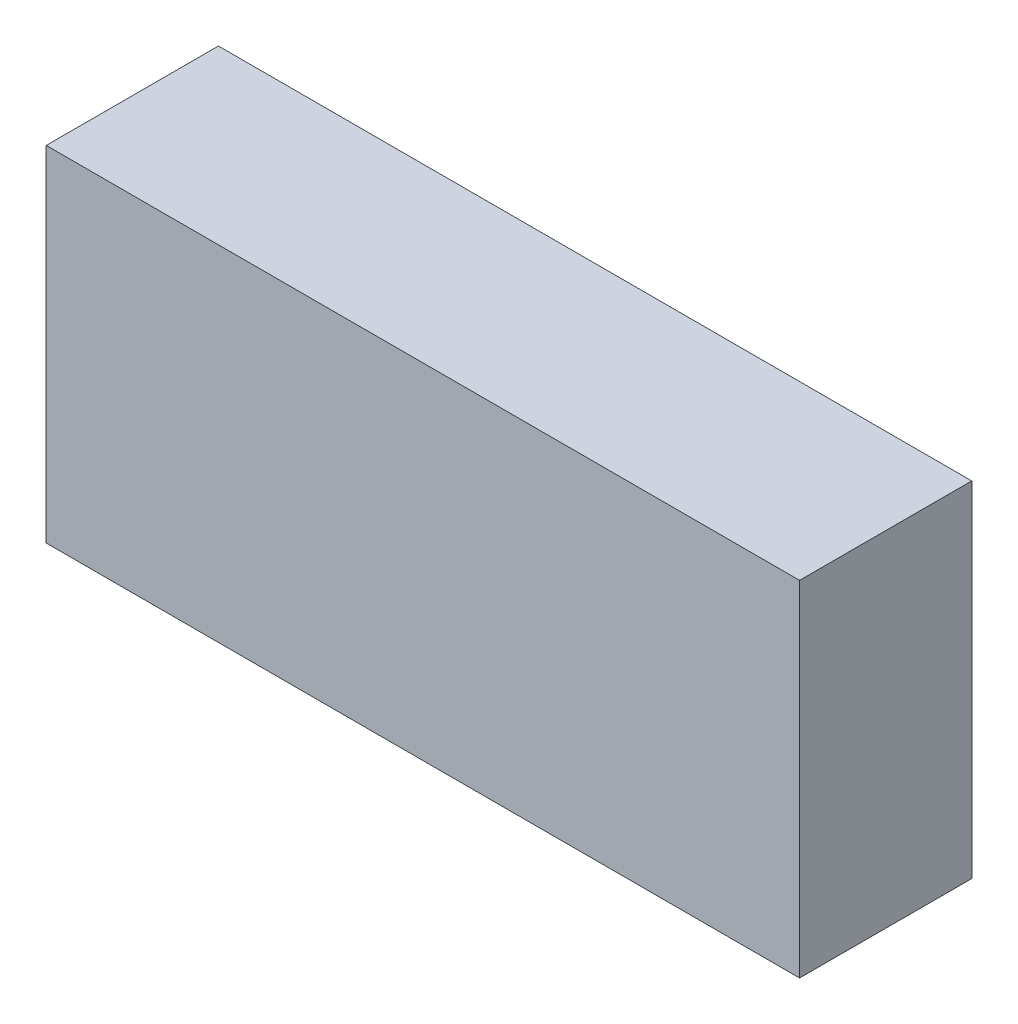
ISO-10303-21;
HEADER;
FILE_DESCRIPTION(('STEP AP214'),'2;1');
FILE_NAME('part.step','',(''),(''),'','','');
FILE_SCHEMA(('AUTOMOTIVE_DESIGN { 1 0 10303 214 1 1 1 1 }'));
ENDSEC;
DATA;
#1=APPLICATION_CONTEXT('core data for automotive mechanical design processes');
#2=APPLICATION_PROTOCOL_DEFINITION('international standard','automotive_design',2000,#1);
#3=PRODUCT_CONTEXT('',#1,'mechanical');
#4=PRODUCT('Part','Part','',(#3));
#5=PRODUCT_RELATED_PRODUCT_CATEGORY('part','',(#4));
#6=PRODUCT_DEFINITION_FORMATION('','',#4);
#7=PRODUCT_DEFINITION_CONTEXT('part definition',#1,'design');
#8=PRODUCT_DEFINITION('design','',#6,#7);
#9=PRODUCT_DEFINITION_SHAPE('','',#8);
#10=(LENGTH_UNIT() NAMED_UNIT(*) SI_UNIT(.MILLI.,.METRE.));
#11=(NAMED_UNIT(*) PLANE_ANGLE_UNIT() SI_UNIT($,.RADIAN.));
#12=(NAMED_UNIT(*) SI_UNIT($,.STERADIAN.) SOLID_ANGLE_UNIT());
#13=UNCERTAINTY_MEASURE_WITH_UNIT(LENGTH_MEASURE(1.E-05),#10,'distance_accuracy_value','');
#14=(GEOMETRIC_REPRESENTATION_CONTEXT(3) GLOBAL_UNCERTAINTY_ASSIGNED_CONTEXT((#13)) GLOBAL_UNIT_ASSIGNED_CONTEXT((#10,
#11,#12)) REPRESENTATION_CONTEXT('',''));
#15=CARTESIAN_POINT('',(0.,0.,0.));
#16=DIRECTION('',(0.,0.,1.));
#17=DIRECTION('',(1.,0.,0.));
#18=AXIS2_PLACEMENT_3D('',#15,#16,#17);
#19=CARTESIAN_POINT('',(-17.5,16.,4.));
#20=DIRECTION('',(1.,0.,0.));
#21=DIRECTION('',(0.,0.,-1.));
#22=AXIS2_PLACEMENT_3D('',#19,#20,#21);
#23=PLANE('',#22);
#24=DIRECTION('',(0.,0.,1.));
#25=VECTOR('',#24,1.);
#26=CARTESIAN_POINT('',(-17.5,0.,4.));
#27=LINE('',#26,#25);
#28=CARTESIAN_POINT('',(-17.5,0.,-4.));
#29=VERTEX_POINT('',#28);
#30=CARTESIAN_POINT('',(-17.5,0.,4.));
#31=VERTEX_POINT('',#30);
#32=EDGE_CURVE('E111',#29,#31,#27,.T.);
#33=ORIENTED_EDGE('',*,*,#32,.T.);
#34=DIRECTION('',(0.,-1.,0.));
#35=VECTOR('',#34,1.);
#36=CARTESIAN_POINT('',(-17.5,16.,4.));
#37=LINE('',#36,#35);
#38=CARTESIAN_POINT('',(-17.5,16.,4.));
#39=VERTEX_POINT('',#38);
#40=EDGE_CURVE('E11',#39,#31,#37,.T.);
#41=ORIENTED_EDGE('',*,*,#40,.F.);
#42=DIRECTION('',(0.,0.,1.));
#43=VECTOR('',#42,1.);
#44=CARTESIAN_POINT('',(-17.5,16.,4.));
#45=LINE('',#44,#43);
#46=CARTESIAN_POINT('',(-17.5,16.,-4.));
#47=VERTEX_POINT('',#46);
#48=EDGE_CURVE('E100',#47,#39,#45,.T.);
#49=ORIENTED_EDGE('',*,*,#48,.F.);
#50=DIRECTION('',(0.,-1.,0.));
#51=VECTOR('',#50,1.);
#52=CARTESIAN_POINT('',(-17.5,16.,-4.));
#53=LINE('',#52,#51);
#54=EDGE_CURVE('E108',#47,#29,#53,.T.);
#55=ORIENTED_EDGE('',*,*,#54,.T.);
#56=EDGE_LOOP('',(#33,#41,#49,#55));
#57=FACE_BOUND('',#56,.T.);
#58=ADVANCED_FACE('F44',(#57),#23,.F.);
#59=CARTESIAN_POINT('',(17.5,16.,4.));
#60=DIRECTION('',(0.,0.,-1.));
#61=DIRECTION('',(-1.,0.,0.));
#62=AXIS2_PLACEMENT_3D('',#59,#60,#61);
#63=PLANE('',#62);
#64=DIRECTION('',(1.,0.,0.));
#65=VECTOR('',#64,1.);
#66=CARTESIAN_POINT('',(17.5,0.,4.));
#67=LINE('',#66,#65);
#68=CARTESIAN_POINT('',(17.5,0.,4.));
#69=VERTEX_POINT('',#68);
#70=EDGE_CURVE('E105',#31,#69,#67,.T.);
#71=ORIENTED_EDGE('',*,*,#70,.T.);
#72=DIRECTION('',(0.,-1.,0.));
#73=VECTOR('',#72,1.);
#74=CARTESIAN_POINT('',(17.5,16.,4.));
#75=LINE('',#74,#73);
#76=CARTESIAN_POINT('',(17.5,16.,4.));
#77=VERTEX_POINT('',#76);
#78=EDGE_CURVE('E53',#77,#69,#75,.T.);
#79=ORIENTED_EDGE('',*,*,#78,.F.);
#80=DIRECTION('',(1.,0.,0.));
#81=VECTOR('',#80,1.);
#82=CARTESIAN_POINT('',(17.5,16.,4.));
#83=LINE('',#82,#81);
#84=EDGE_CURVE('E95',#39,#77,#83,.T.);
#85=ORIENTED_EDGE('',*,*,#84,.F.);
#86=ORIENTED_EDGE('',*,*,#40,.T.);
#87=EDGE_LOOP('',(#71,#79,#85,#86));
#88=FACE_BOUND('',#87,.T.);
#89=ADVANCED_FACE('F102',(#88),#63,.F.);
#90=CARTESIAN_POINT('',(17.5,16.,4.));
#91=DIRECTION('',(-1.,0.,0.));
#92=DIRECTION('',(0.,0.,1.));
#93=AXIS2_PLACEMENT_3D('',#90,#91,#92);
#94=PLANE('',#93);
#95=DIRECTION('',(0.,0.,-1.));
#96=VECTOR('',#95,1.);
#97=CARTESIAN_POINT('',(17.5,0.,4.));
#98=LINE('',#97,#96);
#99=CARTESIAN_POINT('',(17.5,0.,-4.));
#100=VERTEX_POINT('',#99);
#101=EDGE_CURVE('E80',#69,#100,#98,.T.);
#102=ORIENTED_EDGE('',*,*,#101,.T.);
#103=DIRECTION('',(0.,-1.,0.));
#104=VECTOR('',#103,1.);
#105=CARTESIAN_POINT('',(17.5,16.,-4.));
#106=LINE('',#105,#104);
#107=CARTESIAN_POINT('',(17.5,16.,-4.));
#108=VERTEX_POINT('',#107);
#109=EDGE_CURVE('E101',#108,#100,#106,.T.);
#110=ORIENTED_EDGE('',*,*,#109,.F.);
#111=DIRECTION('',(0.,0.,-1.));
#112=VECTOR('',#111,1.);
#113=CARTESIAN_POINT('',(17.5,16.,4.));
#114=LINE('',#113,#112);
#115=EDGE_CURVE('E94',#77,#108,#114,.T.);
#116=ORIENTED_EDGE('',*,*,#115,.F.);
#117=ORIENTED_EDGE('',*,*,#78,.T.);
#118=EDGE_LOOP('',(#102,#110,#116,#117));
#119=FACE_BOUND('',#118,.T.);
#120=ADVANCED_FACE('F103',(#119),#94,.F.);
#121=CARTESIAN_POINT('',(17.5,16.,-4.));
#122=DIRECTION('',(0.,0.,1.));
#123=DIRECTION('',(1.,0.,0.));
#124=AXIS2_PLACEMENT_3D('',#121,#122,#123);
#125=PLANE('',#124);
#126=DIRECTION('',(-1.,0.,0.));
#127=VECTOR('',#126,1.);
#128=CARTESIAN_POINT('',(17.5,0.,-4.));
#129=LINE('',#128,#127);
#130=EDGE_CURVE('E82',#100,#29,#129,.T.);
#131=ORIENTED_EDGE('',*,*,#130,.T.);
#132=ORIENTED_EDGE('',*,*,#54,.F.);
#133=DIRECTION('',(-1.,0.,0.));
#134=VECTOR('',#133,1.);
#135=CARTESIAN_POINT('',(17.5,16.,-4.));
#136=LINE('',#135,#134);
#137=EDGE_CURVE('E62',#108,#47,#136,.T.);
#138=ORIENTED_EDGE('',*,*,#137,.F.);
#139=ORIENTED_EDGE('',*,*,#109,.T.);
#140=EDGE_LOOP('',(#131,#132,#138,#139));
#141=FACE_BOUND('',#140,.T.);
#142=ADVANCED_FACE('F128',(#141),#125,.F.);
#143=CARTESIAN_POINT('',(0.,16.,0.));
#144=DIRECTION('',(0.,1.,0.));
#145=DIRECTION('',(0.,0.,1.));
#146=AXIS2_PLACEMENT_3D('',#143,#144,#145);
#147=PLANE('',#146);
#148=ORIENTED_EDGE('',*,*,#48,.T.);
#149=ORIENTED_EDGE('',*,*,#84,.T.);
#150=ORIENTED_EDGE('',*,*,#115,.T.);
#151=ORIENTED_EDGE('',*,*,#137,.T.);
#152=EDGE_LOOP('',(#148,#149,#150,#151));
#153=FACE_BOUND('',#152,.T.);
#154=ADVANCED_FACE('F93',(#153),#147,.T.);
#155=CARTESIAN_POINT('',(0.,0.,0.));
#156=DIRECTION('',(0.,1.,0.));
#157=DIRECTION('',(0.,0.,1.));
#158=AXIS2_PLACEMENT_3D('',#155,#156,#157);
#159=PLANE('',#158);
#160=ORIENTED_EDGE('',*,*,#32,.F.);
#161=ORIENTED_EDGE('',*,*,#130,.F.);
#162=ORIENTED_EDGE('',*,*,#101,.F.);
#163=ORIENTED_EDGE('',*,*,#70,.F.);
#164=EDGE_LOOP('',(#160,#161,#162,#163));
#165=FACE_BOUND('',#164,.T.);
#166=ADVANCED_FACE('F129',(#165),#159,.F.);
#167=CLOSED_SHELL('',(#58,#89,#120,#142,#154,#166));
#168=MANIFOLD_SOLID_BREP('B2',#167);
#169=ADVANCED_BREP_SHAPE_REPRESENTATION('',(#18,#168),#14);
#170=SHAPE_DEFINITION_REPRESENTATION(#9,#169);
ENDSEC;
END-ISO-10303-21;
